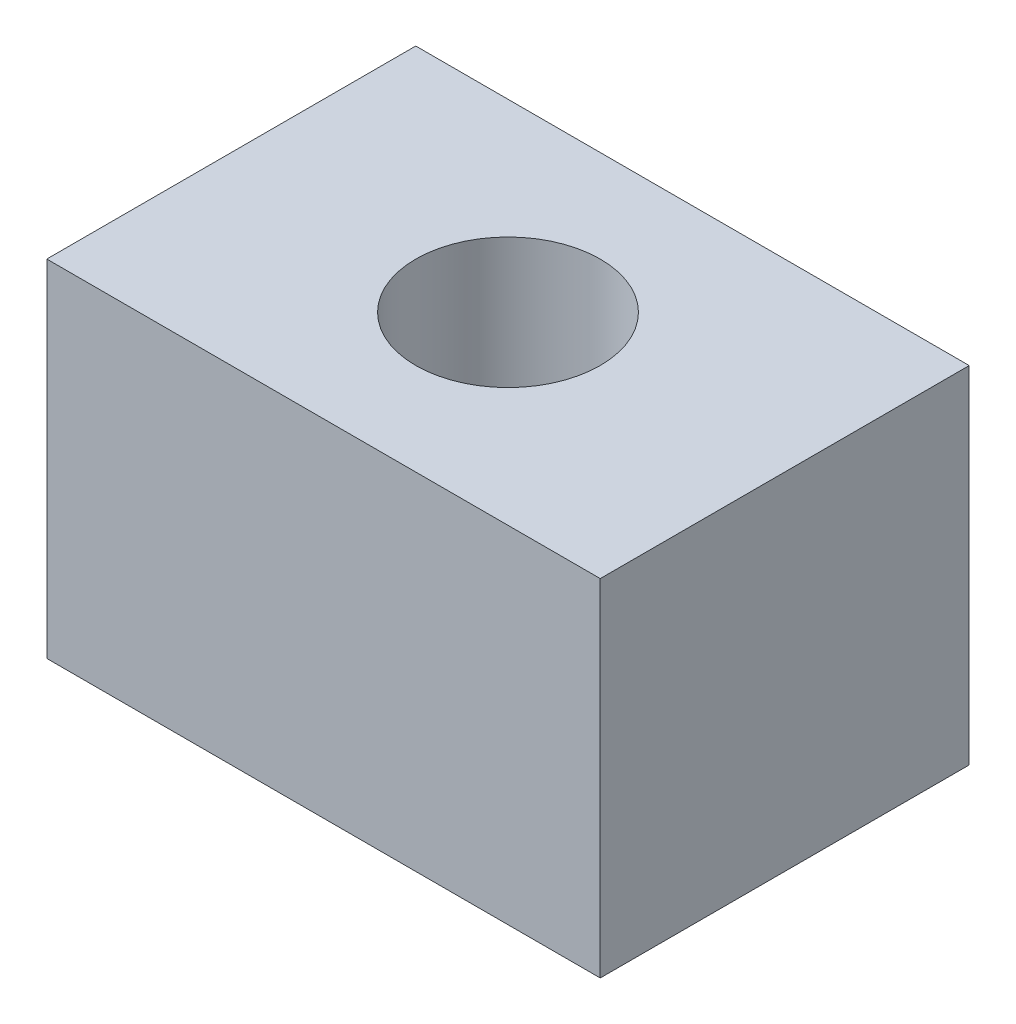
ISO-10303-21;
HEADER;
FILE_DESCRIPTION(('STEP AP214'),'2;1');
FILE_NAME('part.step','',(''),(''),'','','');
FILE_SCHEMA(('AUTOMOTIVE_DESIGN { 1 0 10303 214 1 1 1 1 }'));
ENDSEC;
DATA;
#1=APPLICATION_CONTEXT('core data for automotive mechanical design processes');
#2=APPLICATION_PROTOCOL_DEFINITION('international standard','automotive_design',2000,#1);
#3=PRODUCT_CONTEXT('',#1,'mechanical');
#4=PRODUCT('Part','Part','',(#3));
#5=PRODUCT_RELATED_PRODUCT_CATEGORY('part','',(#4));
#6=PRODUCT_DEFINITION_FORMATION('','',#4);
#7=PRODUCT_DEFINITION_CONTEXT('part definition',#1,'design');
#8=PRODUCT_DEFINITION('design','',#6,#7);
#9=PRODUCT_DEFINITION_SHAPE('','',#8);
#10=(LENGTH_UNIT() NAMED_UNIT(*) SI_UNIT(.MILLI.,.METRE.));
#11=(NAMED_UNIT(*) PLANE_ANGLE_UNIT() SI_UNIT($,.RADIAN.));
#12=(NAMED_UNIT(*) SI_UNIT($,.STERADIAN.) SOLID_ANGLE_UNIT());
#13=UNCERTAINTY_MEASURE_WITH_UNIT(LENGTH_MEASURE(1.E-05),#10,'distance_accuracy_value','');
#14=(GEOMETRIC_REPRESENTATION_CONTEXT(3) GLOBAL_UNCERTAINTY_ASSIGNED_CONTEXT((#13)) GLOBAL_UNIT_ASSIGNED_CONTEXT((#10,
#11,#12)) REPRESENTATION_CONTEXT('',''));
#15=CARTESIAN_POINT('',(0.,0.,0.));
#16=DIRECTION('',(0.,0.,1.));
#17=DIRECTION('',(1.,0.,0.));
#18=AXIS2_PLACEMENT_3D('',#15,#16,#17);
#19=CARTESIAN_POINT('',(0.,9.525,0.));
#20=DIRECTION('',(1.,0.,0.));
#21=DIRECTION('',(0.,0.,-1.));
#22=AXIS2_PLACEMENT_3D('',#19,#20,#21);
#23=PLANE('',#22);
#24=DIRECTION('',(0.,0.,1.));
#25=VECTOR('',#24,1.);
#26=CARTESIAN_POINT('',(0.,0.,0.));
#27=LINE('',#26,#25);
#28=CARTESIAN_POINT('',(0.,0.,-10.16));
#29=VERTEX_POINT('',#28);
#30=CARTESIAN_POINT('',(0.,0.,0.));
#31=VERTEX_POINT('',#30);
#32=EDGE_CURVE('E96',#29,#31,#27,.T.);
#33=ORIENTED_EDGE('',*,*,#32,.T.);
#34=DIRECTION('',(0.,-1.,0.));
#35=VECTOR('',#34,1.);
#36=CARTESIAN_POINT('',(0.,9.525,0.));
#37=LINE('',#36,#35);
#38=CARTESIAN_POINT('',(0.,9.525,0.));
#39=VERTEX_POINT('',#38);
#40=EDGE_CURVE('E11',#39,#31,#37,.T.);
#41=ORIENTED_EDGE('',*,*,#40,.F.);
#42=DIRECTION('',(0.,0.,1.));
#43=VECTOR('',#42,1.);
#44=CARTESIAN_POINT('',(0.,9.525,0.));
#45=LINE('',#44,#43);
#46=CARTESIAN_POINT('',(0.,9.525,-10.16));
#47=VERTEX_POINT('',#46);
#48=EDGE_CURVE('E84',#47,#39,#45,.T.);
#49=ORIENTED_EDGE('',*,*,#48,.F.);
#50=DIRECTION('',(0.,-1.,0.));
#51=VECTOR('',#50,1.);
#52=CARTESIAN_POINT('',(0.,9.525,-10.16));
#53=LINE('',#52,#51);
#54=EDGE_CURVE('E92',#47,#29,#53,.T.);
#55=ORIENTED_EDGE('',*,*,#54,.T.);
#56=EDGE_LOOP('',(#33,#41,#49,#55));
#57=FACE_BOUND('',#56,.T.);
#58=ADVANCED_FACE('F33',(#57),#23,.F.);
#59=CARTESIAN_POINT('',(0.,9.525,0.));
#60=DIRECTION('',(0.,0.,-1.));
#61=DIRECTION('',(-1.,0.,0.));
#62=AXIS2_PLACEMENT_3D('',#59,#60,#61);
#63=PLANE('',#62);
#64=DIRECTION('',(1.,0.,0.));
#65=VECTOR('',#64,1.);
#66=CARTESIAN_POINT('',(0.,0.,0.));
#67=LINE('',#66,#65);
#68=CARTESIAN_POINT('',(15.24,0.,0.));
#69=VERTEX_POINT('',#68);
#70=EDGE_CURVE('E88',#31,#69,#67,.T.);
#71=ORIENTED_EDGE('',*,*,#70,.T.);
#72=DIRECTION('',(0.,-1.,0.));
#73=VECTOR('',#72,1.);
#74=CARTESIAN_POINT('',(15.24,9.525,0.));
#75=LINE('',#74,#73);
#76=CARTESIAN_POINT('',(15.24,9.525,0.));
#77=VERTEX_POINT('',#76);
#78=EDGE_CURVE('E41',#77,#69,#75,.T.);
#79=ORIENTED_EDGE('',*,*,#78,.F.);
#80=DIRECTION('',(1.,0.,0.));
#81=VECTOR('',#80,1.);
#82=CARTESIAN_POINT('',(0.,9.525,0.));
#83=LINE('',#82,#81);
#84=EDGE_CURVE('E79',#39,#77,#83,.T.);
#85=ORIENTED_EDGE('',*,*,#84,.F.);
#86=ORIENTED_EDGE('',*,*,#40,.T.);
#87=EDGE_LOOP('',(#71,#79,#85,#86));
#88=FACE_BOUND('',#87,.T.);
#89=ADVANCED_FACE('F87',(#88),#63,.F.);
#90=CARTESIAN_POINT('',(15.24,9.525,0.));
#91=DIRECTION('',(-1.,0.,0.));
#92=DIRECTION('',(0.,0.,1.));
#93=AXIS2_PLACEMENT_3D('',#90,#91,#92);
#94=PLANE('',#93);
#95=DIRECTION('',(0.,0.,-1.));
#96=VECTOR('',#95,1.);
#97=CARTESIAN_POINT('',(15.24,0.,0.));
#98=LINE('',#97,#96);
#99=CARTESIAN_POINT('',(15.24,0.,-10.16));
#100=VERTEX_POINT('',#99);
#101=EDGE_CURVE('E66',#69,#100,#98,.T.);
#102=ORIENTED_EDGE('',*,*,#101,.T.);
#103=DIRECTION('',(0.,-1.,0.));
#104=VECTOR('',#103,1.);
#105=CARTESIAN_POINT('',(15.24,9.525,-10.16));
#106=LINE('',#105,#104);
#107=CARTESIAN_POINT('',(15.24,9.525,-10.16));
#108=VERTEX_POINT('',#107);
#109=EDGE_CURVE('E89',#108,#100,#106,.T.);
#110=ORIENTED_EDGE('',*,*,#109,.F.);
#111=DIRECTION('',(0.,0.,-1.));
#112=VECTOR('',#111,1.);
#113=CARTESIAN_POINT('',(15.24,9.525,0.));
#114=LINE('',#113,#112);
#115=EDGE_CURVE('E82',#77,#108,#114,.T.);
#116=ORIENTED_EDGE('',*,*,#115,.F.);
#117=ORIENTED_EDGE('',*,*,#78,.T.);
#118=EDGE_LOOP('',(#102,#110,#116,#117));
#119=FACE_BOUND('',#118,.T.);
#120=ADVANCED_FACE('F90',(#119),#94,.F.);
#121=CARTESIAN_POINT('',(0.,9.525,-10.16));
#122=DIRECTION('',(0.,0.,1.));
#123=DIRECTION('',(1.,0.,0.));
#124=AXIS2_PLACEMENT_3D('',#121,#122,#123);
#125=PLANE('',#124);
#126=DIRECTION('',(-1.,0.,0.));
#127=VECTOR('',#126,1.);
#128=CARTESIAN_POINT('',(0.,0.,-10.16));
#129=LINE('',#128,#127);
#130=EDGE_CURVE('E72',#100,#29,#129,.T.);
#131=ORIENTED_EDGE('',*,*,#130,.T.);
#132=ORIENTED_EDGE('',*,*,#54,.F.);
#133=DIRECTION('',(-1.,0.,0.));
#134=VECTOR('',#133,1.);
#135=CARTESIAN_POINT('',(0.,9.525,-10.16));
#136=LINE('',#135,#134);
#137=EDGE_CURVE('E49',#108,#47,#136,.T.);
#138=ORIENTED_EDGE('',*,*,#137,.F.);
#139=ORIENTED_EDGE('',*,*,#109,.T.);
#140=EDGE_LOOP('',(#131,#132,#138,#139));
#141=FACE_BOUND('',#140,.T.);
#142=ADVANCED_FACE('F104',(#141),#125,.F.);
#143=CARTESIAN_POINT('',(0.,9.525,0.));
#144=DIRECTION('',(0.,-1.,0.));
#145=DIRECTION('',(0.,0.,-1.));
#146=AXIS2_PLACEMENT_3D('',#143,#144,#145);
#147=PLANE('',#146);
#148=CARTESIAN_POINT('',(7.62,9.525,-5.08));
#149=DIRECTION('',(0.,1.,0.));
#150=DIRECTION('',(0.,0.,1.));
#151=AXIS2_PLACEMENT_3D('',#148,#149,#150);
#152=CIRCLE('',#151,2.54);
#153=CARTESIAN_POINT('',(7.62,9.525,-2.54));
#154=VERTEX_POINT('',#153);
#155=EDGE_CURVE('E110',#154,#154,#152,.T.);
#156=ORIENTED_EDGE('',*,*,#155,.F.);
#157=EDGE_LOOP('',(#156));
#158=FACE_BOUND('',#157,.T.);
#159=ORIENTED_EDGE('',*,*,#48,.T.);
#160=ORIENTED_EDGE('',*,*,#84,.T.);
#161=ORIENTED_EDGE('',*,*,#115,.T.);
#162=ORIENTED_EDGE('',*,*,#137,.T.);
#163=EDGE_LOOP('',(#159,#160,#161,#162));
#164=FACE_BOUND('',#163,.T.);
#165=ADVANCED_FACE('F80',(#158,#164),#147,.F.);
#166=CARTESIAN_POINT('',(0.,0.,0.));
#167=DIRECTION('',(0.,-1.,0.));
#168=DIRECTION('',(0.,0.,-1.));
#169=AXIS2_PLACEMENT_3D('',#166,#167,#168);
#170=PLANE('',#169);
#171=CARTESIAN_POINT('',(7.62,0.,-5.08));
#172=DIRECTION('',(0.,1.,0.));
#173=DIRECTION('',(0.,0.,1.));
#174=AXIS2_PLACEMENT_3D('',#171,#172,#173);
#175=CIRCLE('',#174,2.54);
#176=CARTESIAN_POINT('',(7.62,0.,-2.54));
#177=VERTEX_POINT('',#176);
#178=EDGE_CURVE('E99',#177,#177,#175,.T.);
#179=ORIENTED_EDGE('',*,*,#178,.T.);
#180=EDGE_LOOP('',(#179));
#181=FACE_BOUND('',#180,.T.);
#182=ORIENTED_EDGE('',*,*,#32,.F.);
#183=ORIENTED_EDGE('',*,*,#130,.F.);
#184=ORIENTED_EDGE('',*,*,#101,.F.);
#185=ORIENTED_EDGE('',*,*,#70,.F.);
#186=EDGE_LOOP('',(#182,#183,#184,#185));
#187=FACE_BOUND('',#186,.T.);
#188=ADVANCED_FACE('F107',(#181,#187),#170,.T.);
#189=CARTESIAN_POINT('',(7.62,0.,-5.08));
#190=DIRECTION('',(0.,1.,0.));
#191=DIRECTION('',(0.,0.,1.));
#192=AXIS2_PLACEMENT_3D('',#189,#190,#191);
#193=CYLINDRICAL_SURFACE('',#192,2.54);
#194=CARTESIAN_POINT('',(7.62,0.,-2.54));
#195=CARTESIAN_POINT('',(7.62,0.0992187499999999,-2.54));
#196=CARTESIAN_POINT('',(7.62,0.1984375,-2.54));
#197=CARTESIAN_POINT('',(7.62,0.396875,-2.54));
#198=CARTESIAN_POINT('',(7.62,0.49609375,-2.54));
#199=CARTESIAN_POINT('',(7.62,0.69453125,-2.54));
#200=CARTESIAN_POINT('',(7.62,0.79375,-2.54));
#201=CARTESIAN_POINT('',(7.62,0.9921875,-2.54));
#202=CARTESIAN_POINT('',(7.62,1.09140625,-2.54));
#203=CARTESIAN_POINT('',(7.62,1.28984375,-2.54));
#204=CARTESIAN_POINT('',(7.62,1.3890625,-2.54));
#205=CARTESIAN_POINT('',(7.62,1.5875,-2.54));
#206=CARTESIAN_POINT('',(7.62,1.68671875,-2.54));
#207=CARTESIAN_POINT('',(7.62,1.88515625,-2.54));
#208=CARTESIAN_POINT('',(7.62,1.984375,-2.54));
#209=CARTESIAN_POINT('',(7.62,2.1828125,-2.54));
#210=CARTESIAN_POINT('',(7.62,2.28203125,-2.54));
#211=CARTESIAN_POINT('',(7.62,2.48046875,-2.54));
#212=CARTESIAN_POINT('',(7.62,2.5796875,-2.54));
#213=CARTESIAN_POINT('',(7.62,2.778125,-2.54));
#214=CARTESIAN_POINT('',(7.62,2.87734375,-2.54));
#215=CARTESIAN_POINT('',(7.62,3.07578125,-2.54));
#216=CARTESIAN_POINT('',(7.62,3.175,-2.54));
#217=CARTESIAN_POINT('',(7.62,3.3734375,-2.54));
#218=CARTESIAN_POINT('',(7.62,3.47265625,-2.54));
#219=CARTESIAN_POINT('',(7.62,3.67109375,-2.54));
#220=CARTESIAN_POINT('',(7.62,3.7703125,-2.54));
#221=CARTESIAN_POINT('',(7.62,3.96875,-2.54));
#222=CARTESIAN_POINT('',(7.62,4.06796875,-2.54));
#223=CARTESIAN_POINT('',(7.62,4.26640625,-2.54));
#224=CARTESIAN_POINT('',(7.62,4.365625,-2.54));
#225=CARTESIAN_POINT('',(7.62,4.5640625,-2.54));
#226=CARTESIAN_POINT('',(7.62,4.66328125,-2.54));
#227=CARTESIAN_POINT('',(7.62,4.86171875,-2.54));
#228=CARTESIAN_POINT('',(7.62,4.9609375,-2.54));
#229=CARTESIAN_POINT('',(7.62,5.159375,-2.54));
#230=CARTESIAN_POINT('',(7.62,5.25859375,-2.54));
#231=CARTESIAN_POINT('',(7.62,5.45703125,-2.54));
#232=CARTESIAN_POINT('',(7.62,5.55625,-2.54));
#233=CARTESIAN_POINT('',(7.62,5.7546875,-2.54));
#234=CARTESIAN_POINT('',(7.62,5.85390625,-2.54));
#235=CARTESIAN_POINT('',(7.62,6.05234375,-2.54));
#236=CARTESIAN_POINT('',(7.62,6.1515625,-2.54));
#237=CARTESIAN_POINT('',(7.62,6.35,-2.54));
#238=CARTESIAN_POINT('',(7.62,6.44921875,-2.54));
#239=CARTESIAN_POINT('',(7.62,6.64765625,-2.54));
#240=CARTESIAN_POINT('',(7.62,6.746875,-2.54));
#241=CARTESIAN_POINT('',(7.62,6.9453125,-2.54));
#242=CARTESIAN_POINT('',(7.62,7.04453125,-2.54));
#243=CARTESIAN_POINT('',(7.62,7.24296875,-2.54));
#244=CARTESIAN_POINT('',(7.62,7.3421875,-2.54));
#245=CARTESIAN_POINT('',(7.62,7.540625,-2.54));
#246=CARTESIAN_POINT('',(7.62,7.63984375,-2.54));
#247=CARTESIAN_POINT('',(7.62,7.83828125,-2.54));
#248=CARTESIAN_POINT('',(7.62,7.9375,-2.54));
#249=CARTESIAN_POINT('',(7.62,8.1359375,-2.54));
#250=CARTESIAN_POINT('',(7.62,8.23515625,-2.54));
#251=CARTESIAN_POINT('',(7.62,8.43359375,-2.54));
#252=CARTESIAN_POINT('',(7.62,8.5328125,-2.54));
#253=CARTESIAN_POINT('',(7.62,8.73125,-2.54));
#254=CARTESIAN_POINT('',(7.62,8.83046875,-2.54));
#255=CARTESIAN_POINT('',(7.62,9.02890625,-2.54));
#256=CARTESIAN_POINT('',(7.62,9.128125,-2.54));
#257=CARTESIAN_POINT('',(7.62,9.3265625,-2.54));
#258=CARTESIAN_POINT('',(7.62,9.42578125,-2.54));
#259=CARTESIAN_POINT('',(7.62,9.525,-2.54));
#260=B_SPLINE_CURVE_WITH_KNOTS('',3,(#194,#195,#196,#197,#198,#199,#200,#201,#202,#203,#204,
#205,#206,#207,#208,#209,#210,#211,#212,#213,#214,#215,#216,#217,#218,#219,#220,#221,#222,#223,
#224,#225,#226,#227,#228,#229,#230,#231,#232,#233,#234,#235,#236,#237,#238,#239,#240,#241,#242,
#243,#244,#245,#246,#247,#248,#249,#250,#251,#252,#253,#254,#255,#256,#257,#258,#259),
.UNSPECIFIED.,.F.,.F.,(4,2,2,2,2,2,2,2,2,2,2,2,2,2,2,2,2,2,2,2,2,2,2,2,2,2,2,2,2,2,2,2,4),(0.,
0.29765625,0.5953125,0.89296875,1.190625,1.48828125,1.7859375,2.08359375,2.38125,2.67890625,
2.9765625,3.27421875,3.571875,3.86953125,4.1671875,4.46484375,4.7625,5.06015625,5.3578125,
5.65546875,5.953125,6.25078125,6.5484375,6.84609375,7.14375,7.44140625,7.7390625,8.03671875,
8.334375,8.63203125,8.9296875,9.22734375,9.525),.UNSPECIFIED.);
#261=EDGE_CURVE('BSEAM117',#177,#154,#260,.T.);
#262=ORIENTED_EDGE('',*,*,#178,.F.);
#263=ORIENTED_EDGE('',*,*,#155,.T.);
#264=ORIENTED_EDGE('',*,*,#261,.T.);
#265=ORIENTED_EDGE('',*,*,#261,.F.);
#266=EDGE_LOOP('',(#262,#264,#263,#265));
#267=FACE_BOUND('',#266,.T.);
#268=ADVANCED_FACE('F117',(#267),#193,.F.);
#269=CLOSED_SHELL('',(#58,#89,#120,#142,#165,#188,#268));
#270=MANIFOLD_SOLID_BREP('B2',#269);
#271=ADVANCED_BREP_SHAPE_REPRESENTATION('',(#18,#270),#14);
#272=SHAPE_DEFINITION_REPRESENTATION(#9,#271);
ENDSEC;
END-ISO-10303-21;
